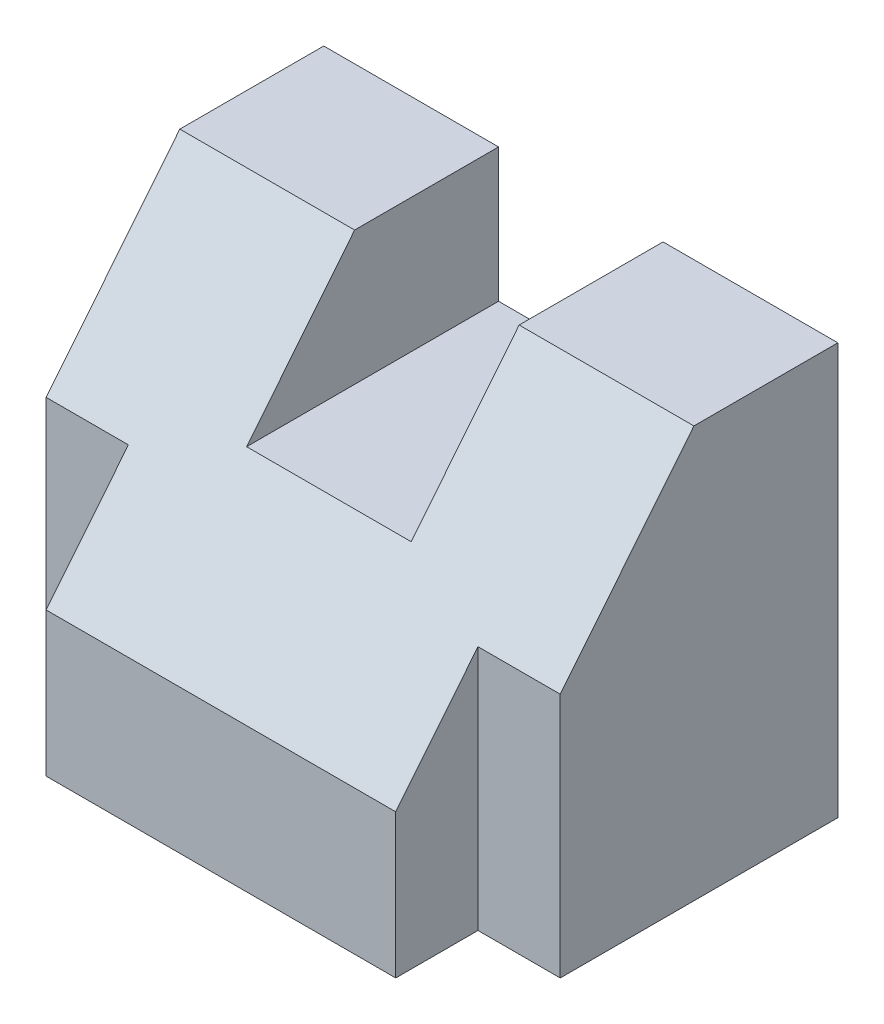
ISO-10303-21;
HEADER;
FILE_DESCRIPTION(('STEP AP214'),'2;1');
FILE_NAME('part.step','',(''),(''),'','','');
FILE_SCHEMA(('AUTOMOTIVE_DESIGN { 1 0 10303 214 1 1 1 1 }'));
ENDSEC;
DATA;
#1=APPLICATION_CONTEXT('core data for automotive mechanical design processes');
#2=APPLICATION_PROTOCOL_DEFINITION('international standard','automotive_design',2000,#1);
#3=PRODUCT_CONTEXT('',#1,'mechanical');
#4=PRODUCT('Part','Part','',(#3));
#5=PRODUCT_RELATED_PRODUCT_CATEGORY('part','',(#4));
#6=PRODUCT_DEFINITION_FORMATION('','',#4);
#7=PRODUCT_DEFINITION_CONTEXT('part definition',#1,'design');
#8=PRODUCT_DEFINITION('design','',#6,#7);
#9=PRODUCT_DEFINITION_SHAPE('','',#8);
#10=(LENGTH_UNIT() NAMED_UNIT(*) SI_UNIT(.MILLI.,.METRE.));
#11=(NAMED_UNIT(*) PLANE_ANGLE_UNIT() SI_UNIT($,.RADIAN.));
#12=(NAMED_UNIT(*) SI_UNIT($,.STERADIAN.) SOLID_ANGLE_UNIT());
#13=UNCERTAINTY_MEASURE_WITH_UNIT(LENGTH_MEASURE(1.E-05),#10,'distance_accuracy_value','');
#14=(GEOMETRIC_REPRESENTATION_CONTEXT(3) GLOBAL_UNCERTAINTY_ASSIGNED_CONTEXT((#13)) GLOBAL_UNIT_ASSIGNED_CONTEXT((#10,
#11,#12)) REPRESENTATION_CONTEXT('',''));
#15=CARTESIAN_POINT('',(0.,0.,0.));
#16=DIRECTION('',(0.,0.,1.));
#17=DIRECTION('',(1.,0.,0.));
#18=AXIS2_PLACEMENT_3D('',#15,#16,#17);
#19=CARTESIAN_POINT('',(0.,80.,0.));
#20=DIRECTION('',(0.,-1.,0.));
#21=DIRECTION('',(0.,0.,-1.));
#22=AXIS2_PLACEMENT_3D('',#19,#20,#21);
#23=PLANE('',#22);
#24=CARTESIAN_POINT('',(0.,80.,28.));
#25=DIRECTION('',(1.,0.,0.));
#26=VECTOR('',#25,1.);
#27=LINE('',#24,#26);
#28=CARTESIAN_POINT('',(0.,80.,28.));
#29=VERTEX_POINT('',#28);
#30=CARTESIAN_POINT('',(34.,80.,28.));
#31=VERTEX_POINT('',#30);
#32=EDGE_CURVE('E455',#29,#31,#27,.T.);
#33=ORIENTED_EDGE('',*,*,#32,.T.);
#34=DIRECTION('',(0.,0.,-1.));
#35=VECTOR('',#34,1.);
#36=CARTESIAN_POINT('',(34.,80.,0.));
#37=LINE('',#36,#35);
#38=CARTESIAN_POINT('',(34.,80.,0.));
#39=VERTEX_POINT('',#38);
#40=EDGE_CURVE('E185',#31,#39,#37,.T.);
#41=ORIENTED_EDGE('',*,*,#40,.T.);
#42=CARTESIAN_POINT('',(0.,80.,0.));
#43=DIRECTION('',(1.,0.,0.));
#44=VECTOR('',#43,1.);
#45=LINE('',#42,#44);
#46=CARTESIAN_POINT('',(0.,80.,0.));
#47=VERTEX_POINT('',#46);
#48=EDGE_CURVE('E457',#47,#39,#45,.T.);
#49=ORIENTED_EDGE('',*,*,#48,.F.);
#50=DIRECTION('',(0.,0.,1.));
#51=VECTOR('',#50,1.);
#52=CARTESIAN_POINT('',(0.,80.,0.));
#53=LINE('',#52,#51);
#54=EDGE_CURVE('E328',#47,#29,#53,.T.);
#55=ORIENTED_EDGE('',*,*,#54,.T.);
#56=EDGE_LOOP('',(#33,#41,#49,#55));
#57=FACE_BOUND('',#56,.T.);
#58=ADVANCED_FACE('F79',(#57),#23,.F.);
#59=CARTESIAN_POINT('',(100.,0.,0.));
#60=DIRECTION('',(1.,0.,0.));
#61=DIRECTION('',(0.,0.,-1.));
#62=AXIS2_PLACEMENT_3D('',#59,#60,#61);
#63=PLANE('',#62);
#64=DIRECTION('',(0.,1.,0.));
#65=VECTOR('',#64,1.);
#66=CARTESIAN_POINT('',(100.,0.,54.));
#67=LINE('',#66,#65);
#68=CARTESIAN_POINT('',(100.,0.,54.));
#69=VERTEX_POINT('',#68);
#70=CARTESIAN_POINT('',(100.,47.8095238095238,54.));
#71=VERTEX_POINT('',#70);
#72=EDGE_CURVE('E203',#69,#71,#67,.T.);
#73=ORIENTED_EDGE('',*,*,#72,.F.);
#74=DIRECTION('',(0.,0.,-1.));
#75=VECTOR('',#74,1.);
#76=CARTESIAN_POINT('',(100.,0.,70.));
#77=LINE('',#76,#75);
#78=CARTESIAN_POINT('',(100.,0.,0.));
#79=VERTEX_POINT('',#78);
#80=EDGE_CURVE('E515',#69,#79,#77,.T.);
#81=ORIENTED_EDGE('',*,*,#80,.T.);
#82=DIRECTION('',(0.,1.,0.));
#83=VECTOR('',#82,1.);
#84=CARTESIAN_POINT('',(100.,0.,0.));
#85=LINE('',#84,#83);
#86=CARTESIAN_POINT('',(100.,80.,0.));
#87=VERTEX_POINT('',#86);
#88=EDGE_CURVE('E517',#79,#87,#85,.T.);
#89=ORIENTED_EDGE('',*,*,#88,.T.);
#90=DIRECTION('',(0.,0.,1.));
#91=VECTOR('',#90,1.);
#92=CARTESIAN_POINT('',(100.,80.,0.));
#93=LINE('',#92,#91);
#94=CARTESIAN_POINT('',(100.,80.,28.));
#95=VERTEX_POINT('',#94);
#96=EDGE_CURVE('E546',#87,#95,#93,.T.);
#97=ORIENTED_EDGE('',*,*,#96,.T.);
#98=DIRECTION('',(0.,-0.777941180203721,0.628337107087621));
#99=VECTOR('',#98,1.);
#100=CARTESIAN_POINT('',(100.,80.,28.));
#101=LINE('',#100,#99);
#102=EDGE_CURVE('E374',#95,#71,#101,.T.);
#103=ORIENTED_EDGE('',*,*,#102,.T.);
#104=EDGE_LOOP('',(#73,#81,#89,#97,#103));
#105=FACE_BOUND('',#104,.T.);
#106=ADVANCED_FACE('F81',(#105),#63,.T.);
#107=CARTESIAN_POINT('',(0.,0.,0.));
#108=DIRECTION('',(1.,0.,0.));
#109=DIRECTION('',(0.,0.,-1.));
#110=AXIS2_PLACEMENT_3D('',#107,#108,#109);
#111=PLANE('',#110);
#112=DIRECTION('',(0.,0.,-1.));
#113=VECTOR('',#112,1.);
#114=CARTESIAN_POINT('',(0.,0.,70.));
#115=LINE('',#114,#113);
#116=CARTESIAN_POINT('',(0.,0.,54.));
#117=VERTEX_POINT('',#116);
#118=CARTESIAN_POINT('',(0.,0.,0.));
#119=VERTEX_POINT('',#118);
#120=EDGE_CURVE('E278',#117,#119,#115,.T.);
#121=ORIENTED_EDGE('',*,*,#120,.F.);
#122=DIRECTION('',(0.,1.,0.));
#123=VECTOR('',#122,1.);
#124=CARTESIAN_POINT('',(0.,0.,54.));
#125=LINE('',#124,#123);
#126=CARTESIAN_POINT('',(0.,47.8095238095238,54.));
#127=VERTEX_POINT('',#126);
#128=EDGE_CURVE('E596',#117,#127,#125,.T.);
#129=ORIENTED_EDGE('',*,*,#128,.T.);
#130=DIRECTION('',(0.,-0.777941180203721,0.628337107087621));
#131=VECTOR('',#130,1.);
#132=CARTESIAN_POINT('',(0.,80.,28.));
#133=LINE('',#132,#131);
#134=EDGE_CURVE('E461',#29,#127,#133,.T.);
#135=ORIENTED_EDGE('',*,*,#134,.F.);
#136=ORIENTED_EDGE('',*,*,#54,.F.);
#137=DIRECTION('',(0.,1.,0.));
#138=VECTOR('',#137,1.);
#139=CARTESIAN_POINT('',(0.,0.,0.));
#140=LINE('',#139,#138);
#141=EDGE_CURVE('E464',#119,#47,#140,.T.);
#142=ORIENTED_EDGE('',*,*,#141,.F.);
#143=EDGE_LOOP('',(#121,#129,#135,#136,#142));
#144=FACE_BOUND('',#143,.T.);
#145=ADVANCED_FACE('F301',(#144),#111,.F.);
#146=CARTESIAN_POINT('',(0.,0.,0.));
#147=DIRECTION('',(0.,0.,1.));
#148=DIRECTION('',(1.,0.,0.));
#149=AXIS2_PLACEMENT_3D('',#146,#147,#148);
#150=PLANE('',#149);
#151=ORIENTED_EDGE('',*,*,#48,.T.);
#152=DIRECTION('',(0.,-1.,0.));
#153=VECTOR('',#152,1.);
#154=CARTESIAN_POINT('',(34.,0.,0.));
#155=LINE('',#154,#153);
#156=CARTESIAN_POINT('',(34.,54.,0.));
#157=VERTEX_POINT('',#156);
#158=EDGE_CURVE('E200',#39,#157,#155,.T.);
#159=ORIENTED_EDGE('',*,*,#158,.T.);
#160=DIRECTION('',(1.,0.,0.));
#161=VECTOR('',#160,1.);
#162=CARTESIAN_POINT('',(0.,54.,0.));
#163=LINE('',#162,#161);
#164=CARTESIAN_POINT('',(66.,54.,0.));
#165=VERTEX_POINT('',#164);
#166=EDGE_CURVE('E191',#157,#165,#163,.T.);
#167=ORIENTED_EDGE('',*,*,#166,.T.);
#168=DIRECTION('',(0.,1.,0.));
#169=VECTOR('',#168,1.);
#170=CARTESIAN_POINT('',(66.,0.,0.));
#171=LINE('',#170,#169);
#172=CARTESIAN_POINT('',(66.,80.,0.));
#173=VERTEX_POINT('',#172);
#174=EDGE_CURVE('E178',#165,#173,#171,.T.);
#175=ORIENTED_EDGE('',*,*,#174,.T.);
#176=CARTESIAN_POINT('',(66.,80.,0.));
#177=DIRECTION('',(1.,0.,0.));
#178=VECTOR('',#177,1.);
#179=LINE('',#176,#178);
#180=EDGE_CURVE('E460',#173,#87,#179,.T.);
#181=ORIENTED_EDGE('',*,*,#180,.T.);
#182=ORIENTED_EDGE('',*,*,#88,.F.);
#183=CARTESIAN_POINT('',(0.,0.,0.));
#184=DIRECTION('',(1.,0.,0.));
#185=VECTOR('',#184,1.);
#186=LINE('',#183,#185);
#187=EDGE_CURVE('E286',#119,#79,#186,.T.);
#188=ORIENTED_EDGE('',*,*,#187,.F.);
#189=ORIENTED_EDGE('',*,*,#141,.T.);
#190=EDGE_LOOP('',(#151,#159,#167,#175,#181,#182,#188,#189));
#191=FACE_BOUND('',#190,.T.);
#192=ADVANCED_FACE('F199',(#191),#150,.F.);
#193=CARTESIAN_POINT('',(0.,0.,0.));
#194=DIRECTION('',(0.,1.,0.));
#195=DIRECTION('',(0.,0.,1.));
#196=AXIS2_PLACEMENT_3D('',#193,#194,#195);
#197=PLANE('',#196);
#198=DIRECTION('',(-1.,0.,0.));
#199=VECTOR('',#198,1.);
#200=CARTESIAN_POINT('',(0.,0.,54.));
#201=LINE('',#200,#199);
#202=CARTESIAN_POINT('',(84.,0.,54.));
#203=VERTEX_POINT('',#202);
#204=EDGE_CURVE('E593',#69,#203,#201,.T.);
#205=ORIENTED_EDGE('',*,*,#204,.T.);
#206=DIRECTION('',(0.,0.,1.));
#207=VECTOR('',#206,1.);
#208=CARTESIAN_POINT('',(84.,0.,0.));
#209=LINE('',#208,#207);
#210=CARTESIAN_POINT('',(84.,0.,70.));
#211=VERTEX_POINT('',#210);
#212=EDGE_CURVE('E592',#203,#211,#209,.T.);
#213=ORIENTED_EDGE('',*,*,#212,.T.);
#214=CARTESIAN_POINT('',(16.,0.,70.));
#215=DIRECTION('',(1.,0.,0.));
#216=VECTOR('',#215,1.);
#217=LINE('',#214,#216);
#218=CARTESIAN_POINT('',(16.,0.,70.));
#219=VERTEX_POINT('',#218);
#220=EDGE_CURVE('E456',#219,#211,#217,.T.);
#221=ORIENTED_EDGE('',*,*,#220,.F.);
#222=DIRECTION('',(0.,0.,-1.));
#223=VECTOR('',#222,1.);
#224=CARTESIAN_POINT('',(16.,0.,0.));
#225=LINE('',#224,#223);
#226=CARTESIAN_POINT('',(16.,0.,54.));
#227=VERTEX_POINT('',#226);
#228=EDGE_CURVE('E268',#219,#227,#225,.T.);
#229=ORIENTED_EDGE('',*,*,#228,.T.);
#230=DIRECTION('',(-1.,0.,0.));
#231=VECTOR('',#230,1.);
#232=CARTESIAN_POINT('',(0.,0.,54.));
#233=LINE('',#232,#231);
#234=EDGE_CURVE('E273',#227,#117,#233,.T.);
#235=ORIENTED_EDGE('',*,*,#234,.T.);
#236=ORIENTED_EDGE('',*,*,#120,.T.);
#237=ORIENTED_EDGE('',*,*,#187,.T.);
#238=ORIENTED_EDGE('',*,*,#80,.F.);
#239=EDGE_LOOP('',(#205,#213,#221,#229,#235,#236,#237,#238));
#240=FACE_BOUND('',#239,.T.);
#241=ADVANCED_FACE('F300',(#240),#197,.F.);
#242=ORIENTED_EDGE('',*,*,#180,.F.);
#243=DIRECTION('',(0.,0.,1.));
#244=VECTOR('',#243,1.);
#245=CARTESIAN_POINT('',(66.,80.,0.));
#246=LINE('',#245,#244);
#247=CARTESIAN_POINT('',(66.,80.,28.));
#248=VERTEX_POINT('',#247);
#249=EDGE_CURVE('E181',#173,#248,#246,.T.);
#250=ORIENTED_EDGE('',*,*,#249,.T.);
#251=CARTESIAN_POINT('',(66.,80.,28.));
#252=DIRECTION('',(1.,0.,0.));
#253=VECTOR('',#252,1.);
#254=LINE('',#251,#253);
#255=EDGE_CURVE('E372',#248,#95,#254,.T.);
#256=ORIENTED_EDGE('',*,*,#255,.T.);
#257=ORIENTED_EDGE('',*,*,#96,.F.);
#258=EDGE_LOOP('',(#242,#250,#256,#257));
#259=FACE_BOUND('',#258,.T.);
#260=ADVANCED_FACE('F335',(#259),#23,.F.);
#261=CARTESIAN_POINT('',(0.,45.2712623097583,56.0501342882722));
#262=DIRECTION('',(0.,-0.628337107087621,-0.777941180203721));
#263=DIRECTION('',(0.,0.777941180203721,-0.628337107087621));
#264=AXIS2_PLACEMENT_3D('',#261,#262,#263);
#265=PLANE('',#264);
#266=DIRECTION('',(-1.,0.,0.));
#267=VECTOR('',#266,1.);
#268=CARTESIAN_POINT('',(0.,54.,49.));
#269=LINE('',#268,#267);
#270=CARTESIAN_POINT('',(66.,54.,49.));
#271=VERTEX_POINT('',#270);
#272=CARTESIAN_POINT('',(34.,54.,49.));
#273=VERTEX_POINT('',#272);
#274=EDGE_CURVE('E90',#271,#273,#269,.T.);
#275=ORIENTED_EDGE('',*,*,#274,.T.);
#276=DIRECTION('',(0.,0.777941180203721,-0.628337107087621));
#277=VECTOR('',#276,1.);
#278=CARTESIAN_POINT('',(34.,45.2712623097583,56.0501342882722));
#279=LINE('',#278,#277);
#280=EDGE_CURVE('E12',#273,#31,#279,.T.);
#281=ORIENTED_EDGE('',*,*,#280,.T.);
#282=ORIENTED_EDGE('',*,*,#32,.F.);
#283=ORIENTED_EDGE('',*,*,#134,.T.);
#284=DIRECTION('',(1.,0.,0.));
#285=VECTOR('',#284,1.);
#286=CARTESIAN_POINT('',(0.,47.8095238095238,54.));
#287=LINE('',#286,#285);
#288=CARTESIAN_POINT('',(16.,47.8095238095238,54.));
#289=VERTEX_POINT('',#288);
#290=EDGE_CURVE('E414',#127,#289,#287,.T.);
#291=ORIENTED_EDGE('',*,*,#290,.T.);
#292=DIRECTION('',(0.,-0.777941180203721,0.628337107087621));
#293=VECTOR('',#292,1.);
#294=CARTESIAN_POINT('',(16.,45.2712623097583,56.0501342882722));
#295=LINE('',#294,#293);
#296=CARTESIAN_POINT('',(16.,28.,70.));
#297=VERTEX_POINT('',#296);
#298=EDGE_CURVE('E265',#289,#297,#295,.T.);
#299=ORIENTED_EDGE('',*,*,#298,.T.);
#300=CARTESIAN_POINT('',(16.,28.,70.));
#301=DIRECTION('',(1.,0.,0.));
#302=VECTOR('',#301,1.);
#303=LINE('',#300,#302);
#304=CARTESIAN_POINT('',(84.,28.,70.));
#305=VERTEX_POINT('',#304);
#306=EDGE_CURVE('E406',#297,#305,#303,.T.);
#307=ORIENTED_EDGE('',*,*,#306,.T.);
#308=DIRECTION('',(0.,0.777941180203721,-0.628337107087621));
#309=VECTOR('',#308,1.);
#310=CARTESIAN_POINT('',(84.,45.2712623097583,56.0501342882722));
#311=LINE('',#310,#309);
#312=CARTESIAN_POINT('',(84.,47.8095238095238,54.));
#313=VERTEX_POINT('',#312);
#314=EDGE_CURVE('E107',#305,#313,#311,.T.);
#315=ORIENTED_EDGE('',*,*,#314,.T.);
#316=DIRECTION('',(1.,0.,0.));
#317=VECTOR('',#316,1.);
#318=CARTESIAN_POINT('',(0.,47.8095238095238,54.));
#319=LINE('',#318,#317);
#320=EDGE_CURVE('E563',#313,#71,#319,.T.);
#321=ORIENTED_EDGE('',*,*,#320,.T.);
#322=ORIENTED_EDGE('',*,*,#102,.F.);
#323=ORIENTED_EDGE('',*,*,#255,.F.);
#324=DIRECTION('',(0.,-0.777941180203721,0.628337107087621));
#325=VECTOR('',#324,1.);
#326=CARTESIAN_POINT('',(66.,45.2712623097583,56.0501342882722));
#327=LINE('',#326,#325);
#328=EDGE_CURVE('E379',#248,#271,#327,.T.);
#329=ORIENTED_EDGE('',*,*,#328,.T.);
#330=EDGE_LOOP('',(#275,#281,#282,#283,#291,#299,#307,#315,#321,#322,#323,#329));
#331=FACE_BOUND('',#330,.T.);
#332=ADVANCED_FACE('F344',(#331),#265,.F.);
#333=CARTESIAN_POINT('',(0.,0.,70.));
#334=DIRECTION('',(0.,0.,-1.));
#335=DIRECTION('',(-1.,0.,0.));
#336=AXIS2_PLACEMENT_3D('',#333,#334,#335);
#337=PLANE('',#336);
#338=ORIENTED_EDGE('',*,*,#220,.T.);
#339=DIRECTION('',(0.,1.,0.));
#340=VECTOR('',#339,1.);
#341=CARTESIAN_POINT('',(84.,0.,70.));
#342=LINE('',#341,#340);
#343=EDGE_CURVE('E418',#211,#305,#342,.T.);
#344=ORIENTED_EDGE('',*,*,#343,.T.);
#345=ORIENTED_EDGE('',*,*,#306,.F.);
#346=DIRECTION('',(0.,-1.,0.));
#347=VECTOR('',#346,1.);
#348=CARTESIAN_POINT('',(16.,0.,70.));
#349=LINE('',#348,#347);
#350=EDGE_CURVE('E412',#297,#219,#349,.T.);
#351=ORIENTED_EDGE('',*,*,#350,.T.);
#352=EDGE_LOOP('',(#338,#344,#345,#351));
#353=FACE_BOUND('',#352,.T.);
#354=ADVANCED_FACE('F240',(#353),#337,.F.);
#355=CARTESIAN_POINT('',(0.,0.,54.));
#356=DIRECTION('',(0.,0.,-1.));
#357=DIRECTION('',(-1.,0.,0.));
#358=AXIS2_PLACEMENT_3D('',#355,#356,#357);
#359=PLANE('',#358);
#360=CARTESIAN_POINT('',(16.,0.,54.));
#361=DIRECTION('',(0.,1.,0.));
#362=VECTOR('',#361,1.);
#363=LINE('',#360,#362);
#364=EDGE_CURVE('E263',#227,#289,#363,.T.);
#365=ORIENTED_EDGE('',*,*,#364,.T.);
#366=ORIENTED_EDGE('',*,*,#290,.F.);
#367=ORIENTED_EDGE('',*,*,#128,.F.);
#368=ORIENTED_EDGE('',*,*,#234,.F.);
#369=EDGE_LOOP('',(#365,#366,#367,#368));
#370=FACE_BOUND('',#369,.T.);
#371=ADVANCED_FACE('F236',(#370),#359,.F.);
#372=CARTESIAN_POINT('',(16.,0.,0.));
#373=DIRECTION('',(1.,0.,0.));
#374=DIRECTION('',(0.,0.,-1.));
#375=AXIS2_PLACEMENT_3D('',#372,#373,#374);
#376=PLANE('',#375);
#377=ORIENTED_EDGE('',*,*,#350,.F.);
#378=ORIENTED_EDGE('',*,*,#298,.F.);
#379=ORIENTED_EDGE('',*,*,#364,.F.);
#380=ORIENTED_EDGE('',*,*,#228,.F.);
#381=EDGE_LOOP('',(#377,#378,#379,#380));
#382=FACE_BOUND('',#381,.T.);
#383=ADVANCED_FACE('F234',(#382),#376,.F.);
#384=CARTESIAN_POINT('',(0.,0.,54.));
#385=DIRECTION('',(0.,0.,-1.));
#386=DIRECTION('',(-1.,0.,0.));
#387=AXIS2_PLACEMENT_3D('',#384,#385,#386);
#388=PLANE('',#387);
#389=ORIENTED_EDGE('',*,*,#72,.T.);
#390=ORIENTED_EDGE('',*,*,#320,.F.);
#391=CARTESIAN_POINT('',(84.,0.,54.));
#392=DIRECTION('',(0.,1.,0.));
#393=VECTOR('',#392,1.);
#394=LINE('',#391,#393);
#395=EDGE_CURVE('E201',#203,#313,#394,.T.);
#396=ORIENTED_EDGE('',*,*,#395,.F.);
#397=ORIENTED_EDGE('',*,*,#204,.F.);
#398=EDGE_LOOP('',(#389,#390,#396,#397));
#399=FACE_BOUND('',#398,.T.);
#400=ADVANCED_FACE('F228',(#399),#388,.F.);
#401=CARTESIAN_POINT('',(84.,0.,0.));
#402=DIRECTION('',(-1.,0.,0.));
#403=DIRECTION('',(0.,0.,1.));
#404=AXIS2_PLACEMENT_3D('',#401,#402,#403);
#405=PLANE('',#404);
#406=ORIENTED_EDGE('',*,*,#395,.T.);
#407=ORIENTED_EDGE('',*,*,#314,.F.);
#408=ORIENTED_EDGE('',*,*,#343,.F.);
#409=ORIENTED_EDGE('',*,*,#212,.F.);
#410=EDGE_LOOP('',(#406,#407,#408,#409));
#411=FACE_BOUND('',#410,.T.);
#412=ADVANCED_FACE('F219',(#411),#405,.F.);
#413=CARTESIAN_POINT('',(0.,54.,0.));
#414=DIRECTION('',(0.,-1.,0.));
#415=DIRECTION('',(0.,0.,-1.));
#416=AXIS2_PLACEMENT_3D('',#413,#414,#415);
#417=PLANE('',#416);
#418=DIRECTION('',(0.,0.,-1.));
#419=VECTOR('',#418,1.);
#420=CARTESIAN_POINT('',(34.,54.,80.));
#421=LINE('',#420,#419);
#422=EDGE_CURVE('E84',#273,#157,#421,.T.);
#423=ORIENTED_EDGE('',*,*,#422,.F.);
#424=ORIENTED_EDGE('',*,*,#274,.F.);
#425=DIRECTION('',(0.,0.,1.));
#426=VECTOR('',#425,1.);
#427=CARTESIAN_POINT('',(66.,54.,-10.));
#428=LINE('',#427,#426);
#429=EDGE_CURVE('E98',#165,#271,#428,.T.);
#430=ORIENTED_EDGE('',*,*,#429,.F.);
#431=ORIENTED_EDGE('',*,*,#166,.F.);
#432=EDGE_LOOP('',(#423,#424,#430,#431));
#433=FACE_BOUND('',#432,.T.);
#434=ADVANCED_FACE('F190',(#433),#417,.F.);
#435=CARTESIAN_POINT('',(34.,0.,0.));
#436=DIRECTION('',(-1.,0.,0.));
#437=DIRECTION('',(0.,0.,1.));
#438=AXIS2_PLACEMENT_3D('',#435,#436,#437);
#439=PLANE('',#438);
#440=ORIENTED_EDGE('',*,*,#40,.F.);
#441=ORIENTED_EDGE('',*,*,#280,.F.);
#442=ORIENTED_EDGE('',*,*,#422,.T.);
#443=ORIENTED_EDGE('',*,*,#158,.F.);
#444=EDGE_LOOP('',(#440,#441,#442,#443));
#445=FACE_BOUND('',#444,.T.);
#446=ADVANCED_FACE('F631',(#445),#439,.F.);
#447=CARTESIAN_POINT('',(66.,0.,0.));
#448=DIRECTION('',(1.,0.,0.));
#449=DIRECTION('',(0.,0.,-1.));
#450=AXIS2_PLACEMENT_3D('',#447,#448,#449);
#451=PLANE('',#450);
#452=ORIENTED_EDGE('',*,*,#429,.T.);
#453=ORIENTED_EDGE('',*,*,#328,.F.);
#454=ORIENTED_EDGE('',*,*,#249,.F.);
#455=ORIENTED_EDGE('',*,*,#174,.F.);
#456=EDGE_LOOP('',(#452,#453,#454,#455));
#457=FACE_BOUND('',#456,.T.);
#458=ADVANCED_FACE('F179',(#457),#451,.F.);
#459=CLOSED_SHELL('',(#58,#106,#145,#192,#241,#260,#332,#354,#371,#383,#400,#412,#434,#446,#458));
#460=MANIFOLD_SOLID_BREP('B2',#459);
#461=ADVANCED_BREP_SHAPE_REPRESENTATION('',(#18,#460),#14);
#462=SHAPE_DEFINITION_REPRESENTATION(#9,#461);
ENDSEC;
END-ISO-10303-21;
